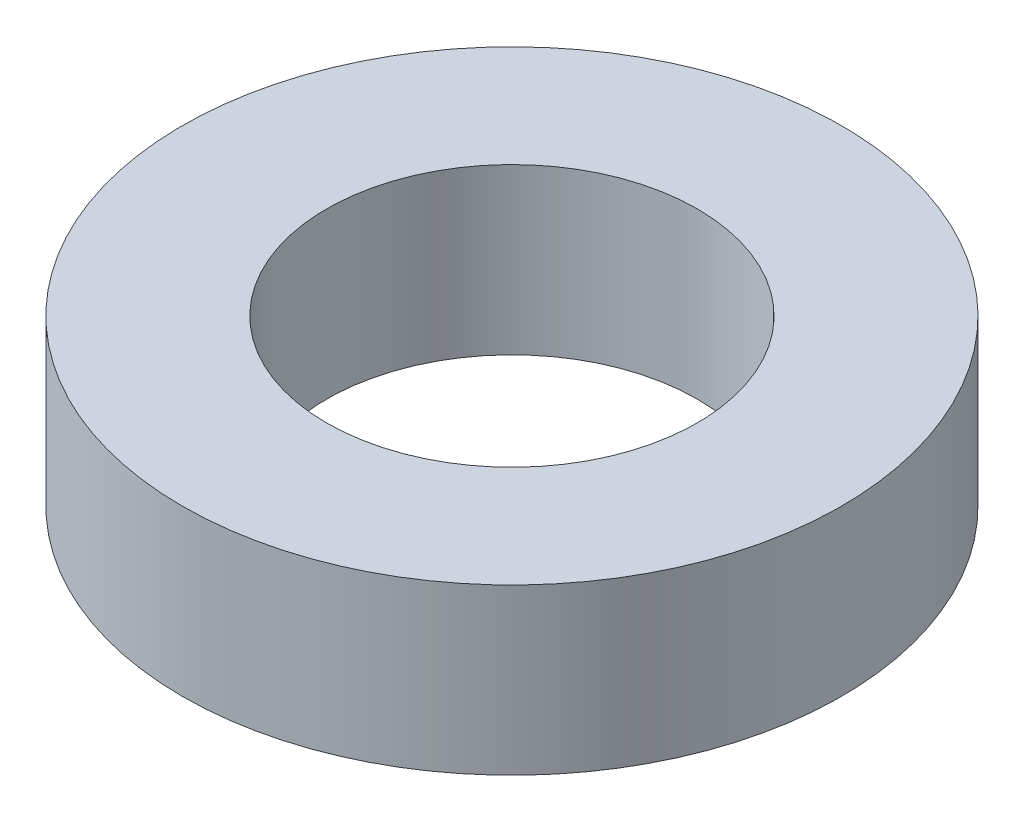
ISO-10303-21;
HEADER;
FILE_DESCRIPTION(('STEP AP214'),'2;1');
FILE_NAME('part.step','',(''),(''),'','','');
FILE_SCHEMA(('AUTOMOTIVE_DESIGN { 1 0 10303 214 1 1 1 1 }'));
ENDSEC;
DATA;
#1=APPLICATION_CONTEXT('core data for automotive mechanical design processes');
#2=APPLICATION_PROTOCOL_DEFINITION('international standard','automotive_design',2000,#1);
#3=PRODUCT_CONTEXT('',#1,'mechanical');
#4=PRODUCT('Part','Part','',(#3));
#5=PRODUCT_RELATED_PRODUCT_CATEGORY('part','',(#4));
#6=PRODUCT_DEFINITION_FORMATION('','',#4);
#7=PRODUCT_DEFINITION_CONTEXT('part definition',#1,'design');
#8=PRODUCT_DEFINITION('design','',#6,#7);
#9=PRODUCT_DEFINITION_SHAPE('','',#8);
#10=(LENGTH_UNIT() NAMED_UNIT(*) SI_UNIT(.MILLI.,.METRE.));
#11=(NAMED_UNIT(*) PLANE_ANGLE_UNIT() SI_UNIT($,.RADIAN.));
#12=(NAMED_UNIT(*) SI_UNIT($,.STERADIAN.) SOLID_ANGLE_UNIT());
#13=UNCERTAINTY_MEASURE_WITH_UNIT(LENGTH_MEASURE(1.E-05),#10,'distance_accuracy_value','');
#14=(GEOMETRIC_REPRESENTATION_CONTEXT(3) GLOBAL_UNCERTAINTY_ASSIGNED_CONTEXT((#13)) GLOBAL_UNIT_ASSIGNED_CONTEXT((#10,
#11,#12)) REPRESENTATION_CONTEXT('',''));
#15=CARTESIAN_POINT('',(0.,0.,0.));
#16=DIRECTION('',(0.,0.,1.));
#17=DIRECTION('',(1.,0.,0.));
#18=AXIS2_PLACEMENT_3D('',#15,#16,#17);
#19=CARTESIAN_POINT('',(0.,4.,0.));
#20=DIRECTION('',(0.,1.,0.));
#21=DIRECTION('',(0.,0.,1.));
#22=AXIS2_PLACEMENT_3D('',#19,#20,#21);
#23=PLANE('',#22);
#24=CARTESIAN_POINT('',(0.,4.,0.));
#25=DIRECTION('',(0.,1.,0.));
#26=DIRECTION('',(0.,0.,1.));
#27=AXIS2_PLACEMENT_3D('',#24,#25,#26);
#28=CIRCLE('',#27,8.);
#29=CARTESIAN_POINT('',(0.,4.,8.));
#30=VERTEX_POINT('',#29);
#31=EDGE_CURVE('E10',#30,#30,#28,.T.);
#32=ORIENTED_EDGE('',*,*,#31,.T.);
#33=EDGE_LOOP('',(#32));
#34=FACE_BOUND('',#33,.T.);
#35=CARTESIAN_POINT('',(0.,4.,0.));
#36=DIRECTION('',(0.,1.,0.));
#37=DIRECTION('',(0.,0.,1.));
#38=AXIS2_PLACEMENT_3D('',#35,#36,#37);
#39=CIRCLE('',#38,4.5);
#40=CARTESIAN_POINT('',(0.,4.,4.5));
#41=VERTEX_POINT('',#40);
#42=EDGE_CURVE('E56',#41,#41,#39,.T.);
#43=ORIENTED_EDGE('',*,*,#42,.F.);
#44=EDGE_LOOP('',(#43));
#45=FACE_BOUND('',#44,.T.);
#46=ADVANCED_FACE('F43',(#34,#45),#23,.T.);
#47=CARTESIAN_POINT('',(0.,0.,0.));
#48=DIRECTION('',(0.,1.,0.));
#49=DIRECTION('',(0.,0.,1.));
#50=AXIS2_PLACEMENT_3D('',#47,#48,#49);
#51=PLANE('',#50);
#52=CARTESIAN_POINT('',(0.,0.,0.));
#53=DIRECTION('',(0.,1.,0.));
#54=DIRECTION('',(0.,0.,1.));
#55=AXIS2_PLACEMENT_3D('',#52,#53,#54);
#56=CIRCLE('',#55,8.);
#57=CARTESIAN_POINT('',(0.,0.,8.));
#58=VERTEX_POINT('',#57);
#59=EDGE_CURVE('E47',#58,#58,#56,.T.);
#60=ORIENTED_EDGE('',*,*,#59,.F.);
#61=EDGE_LOOP('',(#60));
#62=FACE_BOUND('',#61,.T.);
#63=CARTESIAN_POINT('',(0.,0.,0.));
#64=DIRECTION('',(0.,1.,0.));
#65=DIRECTION('',(0.,0.,1.));
#66=AXIS2_PLACEMENT_3D('',#63,#64,#65);
#67=CIRCLE('',#66,4.5);
#68=CARTESIAN_POINT('',(0.,0.,4.5));
#69=VERTEX_POINT('',#68);
#70=EDGE_CURVE('E58',#69,#69,#67,.T.);
#71=ORIENTED_EDGE('',*,*,#70,.T.);
#72=EDGE_LOOP('',(#71));
#73=FACE_BOUND('',#72,.T.);
#74=ADVANCED_FACE('F70',(#62,#73),#51,.F.);
#75=CARTESIAN_POINT('',(0.,4.,0.));
#76=DIRECTION('',(0.,-1.,0.));
#77=DIRECTION('',(0.,0.,-1.));
#78=AXIS2_PLACEMENT_3D('',#75,#76,#77);
#79=CYLINDRICAL_SURFACE('',#78,8.);
#80=ORIENTED_EDGE('',*,*,#31,.F.);
#81=EDGE_LOOP('',(#80));
#82=FACE_BOUND('',#81,.T.);
#83=ORIENTED_EDGE('',*,*,#59,.T.);
#84=EDGE_LOOP('',(#83));
#85=FACE_BOUND('',#84,.T.);
#86=ADVANCED_FACE('F45',(#82,#85),#79,.T.);
#87=CARTESIAN_POINT('',(0.,4.,0.));
#88=DIRECTION('',(0.,-1.,0.));
#89=DIRECTION('',(0.,0.,-1.));
#90=AXIS2_PLACEMENT_3D('',#87,#88,#89);
#91=CYLINDRICAL_SURFACE('',#90,4.5);
#92=ORIENTED_EDGE('',*,*,#42,.T.);
#93=EDGE_LOOP('',(#92));
#94=FACE_BOUND('',#93,.T.);
#95=ORIENTED_EDGE('',*,*,#70,.F.);
#96=EDGE_LOOP('',(#95));
#97=FACE_BOUND('',#96,.T.);
#98=ADVANCED_FACE('F66',(#94,#97),#91,.F.);
#99=CLOSED_SHELL('',(#46,#74,#86,#98));
#100=MANIFOLD_SOLID_BREP('B2',#99);
#101=ADVANCED_BREP_SHAPE_REPRESENTATION('',(#18,#100),#14);
#102=SHAPE_DEFINITION_REPRESENTATION(#9,#101);
ENDSEC;
END-ISO-10303-21;
